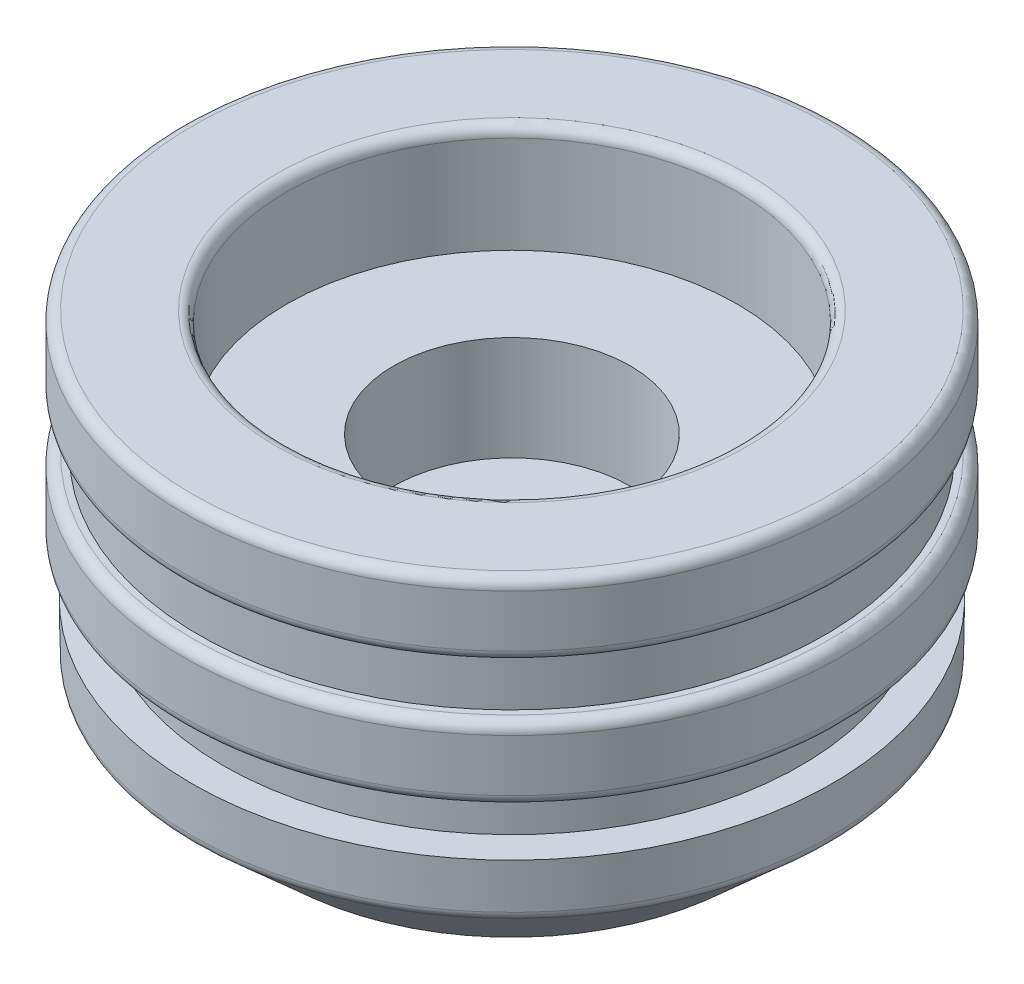
ISO-10303-21;
HEADER;
FILE_DESCRIPTION(('STEP AP214'),'2;1');
FILE_NAME('part.step','',(''),(''),'','','');
FILE_SCHEMA(('AUTOMOTIVE_DESIGN { 1 0 10303 214 1 1 1 1 }'));
ENDSEC;
DATA;
#1=APPLICATION_CONTEXT('core data for automotive mechanical design processes');
#2=APPLICATION_PROTOCOL_DEFINITION('international standard','automotive_design',2000,#1);
#3=PRODUCT_CONTEXT('',#1,'mechanical');
#4=PRODUCT('Part','Part','',(#3));
#5=PRODUCT_RELATED_PRODUCT_CATEGORY('part','',(#4));
#6=PRODUCT_DEFINITION_FORMATION('','',#4);
#7=PRODUCT_DEFINITION_CONTEXT('part definition',#1,'design');
#8=PRODUCT_DEFINITION('design','',#6,#7);
#9=PRODUCT_DEFINITION_SHAPE('','',#8);
#10=(LENGTH_UNIT() NAMED_UNIT(*) SI_UNIT(.MILLI.,.METRE.));
#11=(NAMED_UNIT(*) PLANE_ANGLE_UNIT() SI_UNIT($,.RADIAN.));
#12=(NAMED_UNIT(*) SI_UNIT($,.STERADIAN.) SOLID_ANGLE_UNIT());
#13=UNCERTAINTY_MEASURE_WITH_UNIT(LENGTH_MEASURE(1.E-05),#10,'distance_accuracy_value','');
#14=(GEOMETRIC_REPRESENTATION_CONTEXT(3) GLOBAL_UNCERTAINTY_ASSIGNED_CONTEXT((#13)) GLOBAL_UNIT_ASSIGNED_CONTEXT((#10,
#11,#12)) REPRESENTATION_CONTEXT('',''));
#15=CARTESIAN_POINT('',(0.,0.,0.));
#16=DIRECTION('',(0.,0.,1.));
#17=DIRECTION('',(1.,0.,0.));
#18=AXIS2_PLACEMENT_3D('',#15,#16,#17);
#19=CARTESIAN_POINT('',(-5.47192433256746,0.179065862270625,0.));
#20=DIRECTION('',(0.,1.,0.));
#21=DIRECTION('',(0.,0.,1.));
#22=AXIS2_PLACEMENT_3D('',#19,#20,#21);
#23=PLANE('',#22);
#24=CARTESIAN_POINT('',(-6.60848569894299,0.179065862270625,0.));
#25=DIRECTION('',(0.,-1.,0.));
#26=DIRECTION('',(0.,0.,-1.));
#27=AXIS2_PLACEMENT_3D('',#24,#25,#26);
#28=CIRCLE('',#27,1.13656136637553);
#29=CARTESIAN_POINT('',(-6.60848569894299,0.179065862270625,-1.13656136637553));
#30=VERTEX_POINT('',#29);
#31=EDGE_CURVE('E103',#30,#30,#28,.T.);
#32=ORIENTED_EDGE('',*,*,#31,.F.);
#33=EDGE_LOOP('',(#32));
#34=FACE_BOUND('',#33,.T.);
#35=ADVANCED_FACE('F36',(#34),#23,.T.);
#36=CARTESIAN_POINT('',(-6.60848569894299,-1.43803454259138,0.));
#37=DIRECTION('',(0.,-1.,0.));
#38=DIRECTION('',(0.,0.,-1.));
#39=AXIS2_PLACEMENT_3D('',#36,#37,#38);
#40=PLANE('',#39);
#41=CARTESIAN_POINT('',(-6.60848569894299,-1.43803454259138,0.));
#42=DIRECTION('',(0.,-1.,0.));
#43=DIRECTION('',(0.,0.,-1.));
#44=AXIS2_PLACEMENT_3D('',#41,#42,#43);
#45=CIRCLE('',#44,2.21106052797168);
#46=CARTESIAN_POINT('',(-6.60848569894299,-1.43803454259138,-2.21106052797168));
#47=VERTEX_POINT('',#46);
#48=EDGE_CURVE('E10',#47,#47,#45,.T.);
#49=ORIENTED_EDGE('',*,*,#48,.T.);
#50=EDGE_LOOP('',(#49));
#51=FACE_BOUND('',#50,.T.);
#52=ADVANCED_FACE('F111',(#51),#40,.T.);
#53=CARTESIAN_POINT('',(-6.60848569894299,-1.43803454259138,0.));
#54=DIRECTION('',(0.,1.,0.));
#55=DIRECTION('',(0.,0.,1.));
#56=AXIS2_PLACEMENT_3D('',#53,#54,#55);
#57=CONICAL_SURFACE('',#56,2.21106052797168,0.838914531680178);
#58=CARTESIAN_POINT('',(-6.60848569894299,-0.700292317757054,0.));
#59=DIRECTION('',(0.,-1.,0.));
#60=DIRECTION('',(0.,0.,-1.));
#61=AXIS2_PLACEMENT_3D('',#58,#59,#60);
#62=CIRCLE('',#61,3.03231429755572);
#63=CARTESIAN_POINT('',(-6.60848569894299,-0.700292317757054,-3.03231429755572));
#64=VERTEX_POINT('',#63);
#65=EDGE_CURVE('E42',#64,#64,#62,.T.);
#66=ORIENTED_EDGE('',*,*,#65,.T.);
#67=EDGE_LOOP('',(#66));
#68=FACE_BOUND('',#67,.T.);
#69=ORIENTED_EDGE('',*,*,#48,.F.);
#70=EDGE_LOOP('',(#69));
#71=FACE_BOUND('',#70,.T.);
#72=ADVANCED_FACE('F115',(#68,#71),#57,.T.);
#73=CARTESIAN_POINT('',(-6.60848569894299,-0.625900500589417,0.));
#74=DIRECTION('',(0.,-1.,0.));
#75=DIRECTION('',(0.,0.,-1.));
#76=AXIS2_PLACEMENT_3D('',#73,#74,#75);
#77=TOROIDAL_SURFACE('',#76,2.96548722565744,0.1);
#78=CARTESIAN_POINT('',(-6.60848569894299,-0.627335399578823,0.));
#79=DIRECTION('',(0.,-1.,0.));
#80=DIRECTION('',(0.,0.,-1.));
#81=AXIS2_PLACEMENT_3D('',#78,#79,#80);
#82=CIRCLE('',#81,3.06547693045194);
#83=CARTESIAN_POINT('',(-6.60848569894299,-0.627335399578823,-3.06547693045194));
#84=VERTEX_POINT('',#83);
#85=EDGE_CURVE('E46',#84,#84,#82,.T.);
#86=ORIENTED_EDGE('',*,*,#85,.T.);
#87=EDGE_LOOP('',(#86));
#88=FACE_BOUND('',#87,.T.);
#89=ORIENTED_EDGE('',*,*,#65,.F.);
#90=EDGE_LOOP('',(#89));
#91=FACE_BOUND('',#90,.T.);
#92=ADVANCED_FACE('F119',(#88,#91),#77,.T.);
#93=CARTESIAN_POINT('',(-6.60848569894299,-0.627335399578823,0.));
#94=DIRECTION('',(0.,1.,0.));
#95=DIRECTION('',(0.,0.,1.));
#96=AXIS2_PLACEMENT_3D('',#93,#94,#95);
#97=CONICAL_SURFACE('',#96,3.06547693045194,0.0143494823336692);
#98=CARTESIAN_POINT('',(-6.60848569894299,-0.189044989069313,0.));
#99=DIRECTION('',(0.,-1.,0.));
#100=DIRECTION('',(0.,0.,-1.));
#101=AXIS2_PLACEMENT_3D('',#98,#99,#100);
#102=CIRCLE('',#101,3.07176660265768);
#103=CARTESIAN_POINT('',(-6.60848569894299,-0.189044989069313,-3.07176660265768));
#104=VERTEX_POINT('',#103);
#105=EDGE_CURVE('E50',#104,#104,#102,.T.);
#106=ORIENTED_EDGE('',*,*,#105,.T.);
#107=EDGE_LOOP('',(#106));
#108=FACE_BOUND('',#107,.T.);
#109=ORIENTED_EDGE('',*,*,#85,.F.);
#110=EDGE_LOOP('',(#109));
#111=FACE_BOUND('',#110,.T.);
#112=ADVANCED_FACE('F124',(#108,#111),#97,.T.);
#113=CARTESIAN_POINT('',(-3.83671909628531,-0.189044989069312,0.));
#114=DIRECTION('',(0.,1.,0.));
#115=DIRECTION('',(0.,0.,1.));
#116=AXIS2_PLACEMENT_3D('',#113,#114,#115);
#117=PLANE('',#116);
#118=CARTESIAN_POINT('',(-6.60848569894299,-0.189044989069313,0.));
#119=DIRECTION('',(0.,-1.,0.));
#120=DIRECTION('',(0.,0.,-1.));
#121=AXIS2_PLACEMENT_3D('',#118,#119,#120);
#122=CIRCLE('',#121,2.77176660265768);
#123=CARTESIAN_POINT('',(-6.60848569894299,-0.189044989069313,-2.77176660265768));
#124=VERTEX_POINT('',#123);
#125=EDGE_CURVE('E55',#124,#124,#122,.T.);
#126=ORIENTED_EDGE('',*,*,#125,.T.);
#127=EDGE_LOOP('',(#126));
#128=FACE_BOUND('',#127,.T.);
#129=ORIENTED_EDGE('',*,*,#105,.F.);
#130=EDGE_LOOP('',(#129));
#131=FACE_BOUND('',#130,.T.);
#132=ADVANCED_FACE('F128',(#128,#131),#117,.T.);
#133=CARTESIAN_POINT('',(-6.60848569894299,-1.43803454259138,0.));
#134=DIRECTION('',(0.,-1.,0.));
#135=DIRECTION('',(0.,0.,-1.));
#136=AXIS2_PLACEMENT_3D('',#133,#134,#135);
#137=CYLINDRICAL_SURFACE('',#136,2.77176660265768);
#138=CARTESIAN_POINT('',(-6.60848569894299,0.310955010930687,0.));
#139=DIRECTION('',(0.,-1.,0.));
#140=DIRECTION('',(0.,0.,-1.));
#141=AXIS2_PLACEMENT_3D('',#138,#139,#140);
#142=CIRCLE('',#141,2.77176660265768);
#143=CARTESIAN_POINT('',(-6.60848569894299,0.310955010930687,-2.77176660265768));
#144=VERTEX_POINT('',#143);
#145=EDGE_CURVE('E58',#144,#144,#142,.T.);
#146=ORIENTED_EDGE('',*,*,#145,.T.);
#147=EDGE_LOOP('',(#146));
#148=FACE_BOUND('',#147,.T.);
#149=ORIENTED_EDGE('',*,*,#125,.F.);
#150=EDGE_LOOP('',(#149));
#151=FACE_BOUND('',#150,.T.);
#152=ADVANCED_FACE('F132',(#148,#151),#137,.T.);
#153=CARTESIAN_POINT('',(-3.83671909628531,0.310955010930687,0.));
#154=DIRECTION('',(0.,-1.,0.));
#155=DIRECTION('',(0.,0.,-1.));
#156=AXIS2_PLACEMENT_3D('',#153,#154,#155);
#157=PLANE('',#156);
#158=CARTESIAN_POINT('',(-6.60848569894299,0.310955010930687,0.));
#159=DIRECTION('',(0.,-1.,0.));
#160=DIRECTION('',(0.,0.,-1.));
#161=AXIS2_PLACEMENT_3D('',#158,#159,#160);
#162=CIRCLE('',#161,3.06252832561267);
#163=CARTESIAN_POINT('',(-6.60848569894299,0.310955010930687,-3.06252832561267));
#164=VERTEX_POINT('',#163);
#165=EDGE_CURVE('E61',#164,#164,#162,.T.);
#166=ORIENTED_EDGE('',*,*,#165,.T.);
#167=EDGE_LOOP('',(#166));
#168=FACE_BOUND('',#167,.T.);
#169=ORIENTED_EDGE('',*,*,#145,.F.);
#170=EDGE_LOOP('',(#169));
#171=FACE_BOUND('',#170,.T.);
#172=ADVANCED_FACE('F136',(#168,#171),#157,.T.);
#173=CARTESIAN_POINT('',(-6.60848569894299,0.410955010930687,0.));
#174=DIRECTION('',(0.,-1.,0.));
#175=DIRECTION('',(0.,0.,-1.));
#176=AXIS2_PLACEMENT_3D('',#173,#174,#175);
#177=TOROIDAL_SURFACE('',#176,3.06252832561267,0.1);
#178=CARTESIAN_POINT('',(-6.60848569894299,0.410955010930688,0.));
#179=DIRECTION('',(0.,-1.,0.));
#180=DIRECTION('',(0.,0.,-1.));
#181=AXIS2_PLACEMENT_3D('',#178,#179,#180);
#182=CIRCLE('',#181,3.16252832561267);
#183=CARTESIAN_POINT('',(-6.60848569894299,0.410955010930688,-3.16252832561267));
#184=VERTEX_POINT('',#183);
#185=EDGE_CURVE('E64',#184,#184,#182,.T.);
#186=ORIENTED_EDGE('',*,*,#185,.T.);
#187=EDGE_LOOP('',(#186));
#188=FACE_BOUND('',#187,.T.);
#189=ORIENTED_EDGE('',*,*,#165,.F.);
#190=EDGE_LOOP('',(#189));
#191=FACE_BOUND('',#190,.T.);
#192=ADVANCED_FACE('F140',(#188,#191),#177,.T.);
#193=CARTESIAN_POINT('',(-6.60848569894299,-1.43803454259138,0.));
#194=DIRECTION('',(0.,-1.,0.));
#195=DIRECTION('',(0.,0.,-1.));
#196=AXIS2_PLACEMENT_3D('',#193,#194,#195);
#197=CYLINDRICAL_SURFACE('',#196,3.16252832561267);
#198=CARTESIAN_POINT('',(-6.60848569894299,0.910955010930688,0.));
#199=DIRECTION('',(0.,-1.,0.));
#200=DIRECTION('',(0.,0.,-1.));
#201=AXIS2_PLACEMENT_3D('',#198,#199,#200);
#202=CIRCLE('',#201,3.16252832561267);
#203=CARTESIAN_POINT('',(-6.60848569894299,0.910955010930688,-3.16252832561267));
#204=VERTEX_POINT('',#203);
#205=EDGE_CURVE('E67',#204,#204,#202,.T.);
#206=ORIENTED_EDGE('',*,*,#205,.T.);
#207=EDGE_LOOP('',(#206));
#208=FACE_BOUND('',#207,.T.);
#209=ORIENTED_EDGE('',*,*,#185,.F.);
#210=EDGE_LOOP('',(#209));
#211=FACE_BOUND('',#210,.T.);
#212=ADVANCED_FACE('F144',(#208,#211),#197,.T.);
#213=CARTESIAN_POINT('',(-6.60848569894299,0.910955010930688,0.));
#214=DIRECTION('',(0.,-1.,0.));
#215=DIRECTION('',(0.,0.,-1.));
#216=AXIS2_PLACEMENT_3D('',#213,#214,#215);
#217=TOROIDAL_SURFACE('',#216,3.06252832561267,0.1);
#218=CARTESIAN_POINT('',(-6.60848569894299,1.01095501093069,0.));
#219=DIRECTION('',(0.,-1.,0.));
#220=DIRECTION('',(0.,0.,-1.));
#221=AXIS2_PLACEMENT_3D('',#218,#219,#220);
#222=CIRCLE('',#221,3.06252832561267);
#223=CARTESIAN_POINT('',(-6.60848569894299,1.01095501093069,-3.06252832561267));
#224=VERTEX_POINT('',#223);
#225=EDGE_CURVE('E70',#224,#224,#222,.T.);
#226=ORIENTED_EDGE('',*,*,#225,.T.);
#227=EDGE_LOOP('',(#226));
#228=FACE_BOUND('',#227,.T.);
#229=ORIENTED_EDGE('',*,*,#205,.F.);
#230=EDGE_LOOP('',(#229));
#231=FACE_BOUND('',#230,.T.);
#232=ADVANCED_FACE('F148',(#228,#231),#217,.T.);
#233=CARTESIAN_POINT('',(-3.60589777404571,1.01095501093069,0.));
#234=DIRECTION('',(0.,1.,0.));
#235=DIRECTION('',(0.,0.,1.));
#236=AXIS2_PLACEMENT_3D('',#233,#234,#235);
#237=PLANE('',#236);
#238=CARTESIAN_POINT('',(-6.60848569894299,1.01095501093069,0.));
#239=DIRECTION('',(0.,-1.,0.));
#240=DIRECTION('',(0.,0.,-1.));
#241=AXIS2_PLACEMENT_3D('',#238,#239,#240);
#242=CIRCLE('',#241,3.00258792489728);
#243=CARTESIAN_POINT('',(-6.60848569894299,1.01095501093069,-3.00258792489728));
#244=VERTEX_POINT('',#243);
#245=EDGE_CURVE('E73',#244,#244,#242,.T.);
#246=ORIENTED_EDGE('',*,*,#245,.T.);
#247=EDGE_LOOP('',(#246));
#248=FACE_BOUND('',#247,.T.);
#249=ORIENTED_EDGE('',*,*,#225,.F.);
#250=EDGE_LOOP('',(#249));
#251=FACE_BOUND('',#250,.T.);
#252=ADVANCED_FACE('F152',(#248,#251),#237,.T.);
#253=CARTESIAN_POINT('',(-6.60848569894299,-1.43803454259138,0.));
#254=DIRECTION('',(0.,-1.,0.));
#255=DIRECTION('',(0.,0.,-1.));
#256=AXIS2_PLACEMENT_3D('',#253,#254,#255);
#257=CYLINDRICAL_SURFACE('',#256,3.00258792489728);
#258=CARTESIAN_POINT('',(-6.60848569894299,1.51095501093069,0.));
#259=DIRECTION('',(0.,-1.,0.));
#260=DIRECTION('',(0.,0.,-1.));
#261=AXIS2_PLACEMENT_3D('',#258,#259,#260);
#262=CIRCLE('',#261,3.00258792489728);
#263=CARTESIAN_POINT('',(-6.60848569894299,1.51095501093069,-3.00258792489728));
#264=VERTEX_POINT('',#263);
#265=EDGE_CURVE('E76',#264,#264,#262,.T.);
#266=ORIENTED_EDGE('',*,*,#265,.T.);
#267=EDGE_LOOP('',(#266));
#268=FACE_BOUND('',#267,.T.);
#269=ORIENTED_EDGE('',*,*,#245,.F.);
#270=EDGE_LOOP('',(#269));
#271=FACE_BOUND('',#270,.T.);
#272=ADVANCED_FACE('F156',(#268,#271),#257,.T.);
#273=CARTESIAN_POINT('',(-3.54595737333032,1.51095501093069,0.));
#274=DIRECTION('',(0.,-1.,0.));
#275=DIRECTION('',(0.,0.,-1.));
#276=AXIS2_PLACEMENT_3D('',#273,#274,#275);
#277=PLANE('',#276);
#278=CARTESIAN_POINT('',(-6.60848569894299,1.51095501093069,0.));
#279=DIRECTION('',(0.,-1.,0.));
#280=DIRECTION('',(0.,0.,-1.));
#281=AXIS2_PLACEMENT_3D('',#278,#279,#280);
#282=CIRCLE('',#281,3.06252832561267);
#283=CARTESIAN_POINT('',(-6.60848569894299,1.51095501093069,-3.06252832561267));
#284=VERTEX_POINT('',#283);
#285=EDGE_CURVE('E79',#284,#284,#282,.T.);
#286=ORIENTED_EDGE('',*,*,#285,.T.);
#287=EDGE_LOOP('',(#286));
#288=FACE_BOUND('',#287,.T.);
#289=ORIENTED_EDGE('',*,*,#265,.F.);
#290=EDGE_LOOP('',(#289));
#291=FACE_BOUND('',#290,.T.);
#292=ADVANCED_FACE('F160',(#288,#291),#277,.T.);
#293=CARTESIAN_POINT('',(-6.60848569894299,1.61095501093069,0.));
#294=DIRECTION('',(0.,-1.,0.));
#295=DIRECTION('',(0.,0.,-1.));
#296=AXIS2_PLACEMENT_3D('',#293,#294,#295);
#297=TOROIDAL_SURFACE('',#296,3.06252832561267,0.0999999999999999);
#298=CARTESIAN_POINT('',(-6.60848569894299,1.61095501093069,0.));
#299=DIRECTION('',(0.,-1.,0.));
#300=DIRECTION('',(0.,0.,-1.));
#301=AXIS2_PLACEMENT_3D('',#298,#299,#300);
#302=CIRCLE('',#301,3.16252832561267);
#303=CARTESIAN_POINT('',(-6.60848569894299,1.61095501093069,-3.16252832561267));
#304=VERTEX_POINT('',#303);
#305=EDGE_CURVE('E82',#304,#304,#302,.T.);
#306=ORIENTED_EDGE('',*,*,#305,.T.);
#307=EDGE_LOOP('',(#306));
#308=FACE_BOUND('',#307,.T.);
#309=ORIENTED_EDGE('',*,*,#285,.F.);
#310=EDGE_LOOP('',(#309));
#311=FACE_BOUND('',#310,.T.);
#312=ADVANCED_FACE('F164',(#308,#311),#297,.T.);
#313=CARTESIAN_POINT('',(-6.60848569894299,-1.43803454259138,0.));
#314=DIRECTION('',(0.,-1.,0.));
#315=DIRECTION('',(0.,0.,-1.));
#316=AXIS2_PLACEMENT_3D('',#313,#314,#315);
#317=CYLINDRICAL_SURFACE('',#316,3.16252832561267);
#318=CARTESIAN_POINT('',(-6.60848569894299,2.11095501093069,0.));
#319=DIRECTION('',(0.,-1.,0.));
#320=DIRECTION('',(0.,0.,-1.));
#321=AXIS2_PLACEMENT_3D('',#318,#319,#320);
#322=CIRCLE('',#321,3.16252832561267);
#323=CARTESIAN_POINT('',(-6.60848569894299,2.11095501093069,-3.16252832561267));
#324=VERTEX_POINT('',#323);
#325=EDGE_CURVE('E85',#324,#324,#322,.T.);
#326=ORIENTED_EDGE('',*,*,#325,.T.);
#327=EDGE_LOOP('',(#326));
#328=FACE_BOUND('',#327,.T.);
#329=ORIENTED_EDGE('',*,*,#305,.F.);
#330=EDGE_LOOP('',(#329));
#331=FACE_BOUND('',#330,.T.);
#332=ADVANCED_FACE('F168',(#328,#331),#317,.T.);
#333=CARTESIAN_POINT('',(-6.60848569894299,2.11095501093069,0.));
#334=DIRECTION('',(0.,-1.,0.));
#335=DIRECTION('',(0.,0.,-1.));
#336=AXIS2_PLACEMENT_3D('',#333,#334,#335);
#337=TOROIDAL_SURFACE('',#336,3.06252832561267,0.1);
#338=CARTESIAN_POINT('',(-6.60848569894299,2.21095501093069,0.));
#339=DIRECTION('',(0.,-1.,0.));
#340=DIRECTION('',(0.,0.,-1.));
#341=AXIS2_PLACEMENT_3D('',#338,#339,#340);
#342=CIRCLE('',#341,3.06252832561267);
#343=CARTESIAN_POINT('',(-6.60848569894299,2.21095501093069,-3.06252832561267));
#344=VERTEX_POINT('',#343);
#345=EDGE_CURVE('E88',#344,#344,#342,.T.);
#346=ORIENTED_EDGE('',*,*,#345,.T.);
#347=EDGE_LOOP('',(#346));
#348=FACE_BOUND('',#347,.T.);
#349=ORIENTED_EDGE('',*,*,#325,.F.);
#350=EDGE_LOOP('',(#349));
#351=FACE_BOUND('',#350,.T.);
#352=ADVANCED_FACE('F172',(#348,#351),#337,.T.);
#353=CARTESIAN_POINT('',(-4.34595737333032,2.21095501093069,0.));
#354=DIRECTION('',(0.,1.,0.));
#355=DIRECTION('',(0.,0.,1.));
#356=AXIS2_PLACEMENT_3D('',#353,#354,#355);
#357=PLANE('',#356);
#358=CARTESIAN_POINT('',(-6.60848569894299,2.21095501093069,0.));
#359=DIRECTION('',(0.,-1.,0.));
#360=DIRECTION('',(0.,0.,-1.));
#361=AXIS2_PLACEMENT_3D('',#358,#359,#360);
#362=CIRCLE('',#361,2.26252832561267);
#363=CARTESIAN_POINT('',(-6.60848569894299,2.21095501093069,-2.26252832561267));
#364=VERTEX_POINT('',#363);
#365=EDGE_CURVE('E91',#364,#364,#362,.T.);
#366=ORIENTED_EDGE('',*,*,#365,.T.);
#367=EDGE_LOOP('',(#366));
#368=FACE_BOUND('',#367,.T.);
#369=ORIENTED_EDGE('',*,*,#345,.F.);
#370=EDGE_LOOP('',(#369));
#371=FACE_BOUND('',#370,.T.);
#372=ADVANCED_FACE('F176',(#368,#371),#357,.T.);
#373=CARTESIAN_POINT('',(-6.60848569894299,2.11095501093069,0.));
#374=DIRECTION('',(0.,-1.,0.));
#375=DIRECTION('',(0.,0.,-1.));
#376=AXIS2_PLACEMENT_3D('',#373,#374,#375);
#377=TOROIDAL_SURFACE('',#376,2.26252832561267,0.0999999999999996);
#378=CARTESIAN_POINT('',(-6.60848569894299,2.11095501093069,0.));
#379=DIRECTION('',(0.,-1.,0.));
#380=DIRECTION('',(0.,0.,-1.));
#381=AXIS2_PLACEMENT_3D('',#378,#379,#380);
#382=CIRCLE('',#381,2.16252832561267);
#383=CARTESIAN_POINT('',(-6.60848569894299,2.11095501093069,-2.16252832561267));
#384=VERTEX_POINT('',#383);
#385=EDGE_CURVE('E94',#384,#384,#382,.T.);
#386=ORIENTED_EDGE('',*,*,#385,.T.);
#387=EDGE_LOOP('',(#386));
#388=FACE_BOUND('',#387,.T.);
#389=ORIENTED_EDGE('',*,*,#365,.F.);
#390=EDGE_LOOP('',(#389));
#391=FACE_BOUND('',#390,.T.);
#392=ADVANCED_FACE('F180',(#388,#391),#377,.T.);
#393=CARTESIAN_POINT('',(-6.60848569894299,-1.43803454259138,0.));
#394=DIRECTION('',(0.,-1.,0.));
#395=DIRECTION('',(0.,0.,-1.));
#396=AXIS2_PLACEMENT_3D('',#393,#394,#395);
#397=CYLINDRICAL_SURFACE('',#396,2.16252832561267);
#398=CARTESIAN_POINT('',(-6.60848569894299,1.17906586227063,0.));
#399=DIRECTION('',(0.,-1.,0.));
#400=DIRECTION('',(0.,0.,-1.));
#401=AXIS2_PLACEMENT_3D('',#398,#399,#400);
#402=CIRCLE('',#401,2.16252832561267);
#403=CARTESIAN_POINT('',(-6.60848569894299,1.17906586227063,-2.16252832561267));
#404=VERTEX_POINT('',#403);
#405=EDGE_CURVE('E97',#404,#404,#402,.T.);
#406=ORIENTED_EDGE('',*,*,#405,.T.);
#407=EDGE_LOOP('',(#406));
#408=FACE_BOUND('',#407,.T.);
#409=ORIENTED_EDGE('',*,*,#385,.F.);
#410=EDGE_LOOP('',(#409));
#411=FACE_BOUND('',#410,.T.);
#412=ADVANCED_FACE('F184',(#408,#411),#397,.F.);
#413=CARTESIAN_POINT('',(-5.47192433256746,1.17906586227063,0.));
#414=DIRECTION('',(0.,1.,0.));
#415=DIRECTION('',(0.,0.,1.));
#416=AXIS2_PLACEMENT_3D('',#413,#414,#415);
#417=PLANE('',#416);
#418=CARTESIAN_POINT('',(-6.60848569894299,1.17906586227063,0.));
#419=DIRECTION('',(0.,-1.,0.));
#420=DIRECTION('',(0.,0.,-1.));
#421=AXIS2_PLACEMENT_3D('',#418,#419,#420);
#422=CIRCLE('',#421,1.13656136637553);
#423=CARTESIAN_POINT('',(-6.60848569894299,1.17906586227063,-1.13656136637553));
#424=VERTEX_POINT('',#423);
#425=EDGE_CURVE('E100',#424,#424,#422,.T.);
#426=ORIENTED_EDGE('',*,*,#425,.T.);
#427=EDGE_LOOP('',(#426));
#428=FACE_BOUND('',#427,.T.);
#429=ORIENTED_EDGE('',*,*,#405,.F.);
#430=EDGE_LOOP('',(#429));
#431=FACE_BOUND('',#430,.T.);
#432=ADVANCED_FACE('F188',(#428,#431),#417,.T.);
#433=CARTESIAN_POINT('',(-6.60848569894299,-1.43803454259138,0.));
#434=DIRECTION('',(0.,-1.,0.));
#435=DIRECTION('',(0.,0.,-1.));
#436=AXIS2_PLACEMENT_3D('',#433,#434,#435);
#437=CYLINDRICAL_SURFACE('',#436,1.13656136637553);
#438=ORIENTED_EDGE('',*,*,#31,.T.);
#439=EDGE_LOOP('',(#438));
#440=FACE_BOUND('',#439,.T.);
#441=ORIENTED_EDGE('',*,*,#425,.F.);
#442=EDGE_LOOP('',(#441));
#443=FACE_BOUND('',#442,.T.);
#444=ADVANCED_FACE('F107',(#440,#443),#437,.F.);
#445=CLOSED_SHELL('',(#35,#52,#72,#92,#112,#132,#152,#172,#192,#212,#232,#252,#272,#292,#312,
#332,#352,#372,#392,#412,#432,#444));
#446=MANIFOLD_SOLID_BREP('B2',#445);
#447=ADVANCED_BREP_SHAPE_REPRESENTATION('',(#18,#446),#14);
#448=SHAPE_DEFINITION_REPRESENTATION(#9,#447);
ENDSEC;
END-ISO-10303-21;
